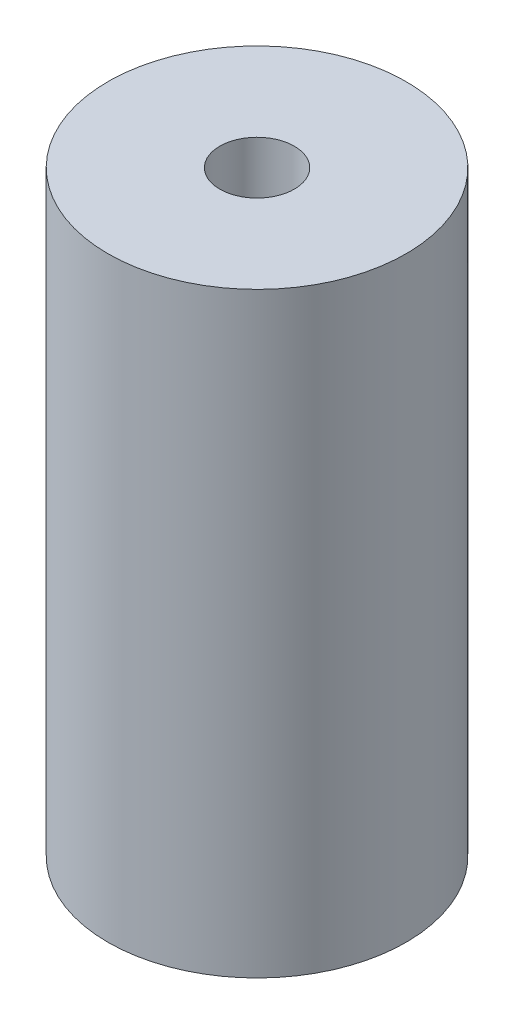
ISO-10303-21;
HEADER;
FILE_DESCRIPTION(('STEP AP214'),'2;1');
FILE_NAME('part.step','',(''),(''),'','','');
FILE_SCHEMA(('AUTOMOTIVE_DESIGN { 1 0 10303 214 1 1 1 1 }'));
ENDSEC;
DATA;
#1=APPLICATION_CONTEXT('core data for automotive mechanical design processes');
#2=APPLICATION_PROTOCOL_DEFINITION('international standard','automotive_design',2000,#1);
#3=PRODUCT_CONTEXT('',#1,'mechanical');
#4=PRODUCT('Part','Part','',(#3));
#5=PRODUCT_RELATED_PRODUCT_CATEGORY('part','',(#4));
#6=PRODUCT_DEFINITION_FORMATION('','',#4);
#7=PRODUCT_DEFINITION_CONTEXT('part definition',#1,'design');
#8=PRODUCT_DEFINITION('design','',#6,#7);
#9=PRODUCT_DEFINITION_SHAPE('','',#8);
#10=(LENGTH_UNIT() NAMED_UNIT(*) SI_UNIT(.MILLI.,.METRE.));
#11=(NAMED_UNIT(*) PLANE_ANGLE_UNIT() SI_UNIT($,.RADIAN.));
#12=(NAMED_UNIT(*) SI_UNIT($,.STERADIAN.) SOLID_ANGLE_UNIT());
#13=UNCERTAINTY_MEASURE_WITH_UNIT(LENGTH_MEASURE(1.E-05),#10,'distance_accuracy_value','');
#14=(GEOMETRIC_REPRESENTATION_CONTEXT(3) GLOBAL_UNCERTAINTY_ASSIGNED_CONTEXT((#13)) GLOBAL_UNIT_ASSIGNED_CONTEXT((#10,
#11,#12)) REPRESENTATION_CONTEXT('',''));
#15=CARTESIAN_POINT('',(0.,0.,0.));
#16=DIRECTION('',(0.,0.,1.));
#17=DIRECTION('',(1.,0.,0.));
#18=AXIS2_PLACEMENT_3D('',#15,#16,#17);
#19=CARTESIAN_POINT('',(0.,40.,0.));
#20=DIRECTION('',(0.,-1.,0.));
#21=DIRECTION('',(0.,0.,-1.));
#22=AXIS2_PLACEMENT_3D('',#19,#20,#21);
#23=CYLINDRICAL_SURFACE('',#22,10.);
#24=CARTESIAN_POINT('',(0.,22.5,-10.));
#25=CARTESIAN_POINT('',(-0.138126814449552,22.4999961237697,-9.99999766446687));
#26=CARTESIAN_POINT('',(-0.276296929717938,22.4885140820437,-9.99710963553044));
#27=CARTESIAN_POINT('',(-0.548677206284221,22.442958081155,-9.98586856383157));
#28=CARTESIAN_POINT('',(-0.682885078117899,22.4088713174369,-9.97751242366627));
#29=CARTESIAN_POINT('',(-0.943368120304294,22.3192679108965,-9.9562604388672));
#30=CARTESIAN_POINT('',(-1.06965260571667,22.2637770021412,-9.94337004736764));
#31=CARTESIAN_POINT('',(-1.31112021984071,22.1330310165919,-9.91442239679369));
#32=CARTESIAN_POINT('',(-1.42630297391461,22.0577752731351,-9.89836503090261));
#33=CARTESIAN_POINT('',(-1.64466987883486,21.8879986839097,-9.86445689319489));
#34=CARTESIAN_POINT('',(-1.74759281676843,21.7931473750682,-9.84657845246877));
#35=CARTESIAN_POINT('',(-1.93624821200553,21.5875796584849,-9.8112270019656));
#36=CARTESIAN_POINT('',(-2.02197872824865,21.4768614617551,-9.79375403816446));
#37=CARTESIAN_POINT('',(-2.17504423799829,21.240674622105,-9.76091292830281));
#38=CARTESIAN_POINT('',(-2.2420870265419,21.1150112819855,-9.74557990774685));
#39=CARTESIAN_POINT('',(-2.35399484758457,20.8537526472333,-9.71915824696694));
#40=CARTESIAN_POINT('',(-2.39886342573357,20.7181589444466,-9.70806892824031));
#41=CARTESIAN_POINT('',(-2.46425806134127,20.4437608363306,-9.69167461160538));
#42=CARTESIAN_POINT('',(-2.48525378055342,20.30507517327,-9.68625818328352));
#43=CARTESIAN_POINT('',(-2.50376962511068,20.0260523850011,-9.68148937432652));
#44=CARTESIAN_POINT('',(-2.50129356969685,19.8857155321798,-9.68213600713214));
#45=CARTESIAN_POINT('',(-2.47331087439951,19.6109736537577,-9.68932009194695));
#46=CARTESIAN_POINT('',(-2.44836390031772,19.4765072975578,-9.69571438345489));
#47=CARTESIAN_POINT('',(-2.37704031150499,19.2137315818149,-9.71344516118448));
#48=CARTESIAN_POINT('',(-2.33066217011566,19.0854226616185,-9.72478199948731));
#49=CARTESIAN_POINT('',(-2.21731579656198,18.8371033062465,-9.75125189842765));
#50=CARTESIAN_POINT('',(-2.1501444453882,18.7171897136841,-9.76642212449693));
#51=CARTESIAN_POINT('',(-1.99726046002491,18.4901354837386,-9.79882851409985));
#52=CARTESIAN_POINT('',(-1.91154458134806,18.3829970865546,-9.81606503891047));
#53=CARTESIAN_POINT('',(-1.72110570780203,18.181327307176,-9.85126467566486));
#54=CARTESIAN_POINT('',(-1.61591043027643,18.0872425165644,-9.86923449130002));
#55=CARTESIAN_POINT('',(-1.39101986250616,17.9179645958935,-9.90343275964594));
#56=CARTESIAN_POINT('',(-1.27132412951324,17.8427720428941,-9.91966115915679));
#57=CARTESIAN_POINT('',(-1.02019314780232,17.7132490229594,-9.94862886823651));
#58=CARTESIAN_POINT('',(-0.888718988681039,17.658991099576,-9.96135600212879));
#59=CARTESIAN_POINT('',(-0.618126680238138,17.5734711571507,-9.98179861652361));
#60=CARTESIAN_POINT('',(-0.479009998584141,17.5422047393031,-9.98951505565468));
#61=CARTESIAN_POINT('',(-0.200899950650045,17.5042373907353,-9.99892498785624));
#62=CARTESIAN_POINT('',(-0.0619945333136836,17.4969282898745,-10.0007675584713));
#63=CARTESIAN_POINT('',(0.215054791335847,17.5054150034258,-9.99864674690754));
#64=CARTESIAN_POINT('',(0.353198766074327,17.5212087379986,-9.99468388736421));
#65=CARTESIAN_POINT('',(0.622690447960817,17.5749515139856,-9.98149301878918));
#66=CARTESIAN_POINT('',(0.754108531614583,17.6125687724616,-9.97234390309647));
#67=CARTESIAN_POINT('',(1.00876215408753,17.7085118067141,-9.94981177723595));
#68=CARTESIAN_POINT('',(1.13199686505442,17.7668396738554,-9.93642833949965));
#69=CARTESIAN_POINT('',(1.36920522404972,17.9037268814578,-9.9065551321037));
#70=CARTESIAN_POINT('',(1.48297573639294,17.9826268539943,-9.89001445610999));
#71=CARTESIAN_POINT('',(1.69587768940552,18.1579831813286,-9.85574181979586));
#72=CARTESIAN_POINT('',(1.79500659828875,18.2544425660294,-9.83800965421578));
#73=CARTESIAN_POINT('',(1.97831761345414,18.4650032680728,-9.80281594932498));
#74=CARTESIAN_POINT('',(2.06207311270184,18.5794795049993,-9.78537173637463));
#75=CARTESIAN_POINT('',(2.20918459835604,18.8212210574476,-9.75321463970069));
#76=CARTESIAN_POINT('',(2.27254149026901,18.9484858049507,-9.73850163474941));
#77=CARTESIAN_POINT('',(2.37658570101223,19.2115095373437,-9.71363491194665));
#78=CARTESIAN_POINT('',(2.41740732773931,19.3472127138538,-9.70345425375809));
#79=CARTESIAN_POINT('',(2.47557609990489,19.6238493964255,-9.68877906706586));
#80=CARTESIAN_POINT('',(2.49292837912652,19.7647817517024,-9.68428329504044));
#81=CARTESIAN_POINT('',(2.50339765056083,20.0435350397694,-9.68158168701612));
#82=CARTESIAN_POINT('',(2.49719649630131,20.1813290585441,-9.68319887888034));
#83=CARTESIAN_POINT('',(2.46229546385366,20.4538398144438,-9.69213181672143));
#84=CARTESIAN_POINT('',(2.43359603781098,20.5885566133553,-9.69944744817731));
#85=CARTESIAN_POINT('',(2.35488553240495,20.8503474317764,-9.71885434473222));
#86=CARTESIAN_POINT('',(2.30500234113404,20.9774621754006,-9.73091692061057));
#87=CARTESIAN_POINT('',(2.18544152267504,21.2216089711893,-9.7584625954084));
#88=CARTESIAN_POINT('',(2.11576115005696,21.3386396219781,-9.77394616867808));
#89=CARTESIAN_POINT('',(1.95644624772858,21.5625910483368,-9.80709390439337));
#90=CARTESIAN_POINT('',(1.86633860485376,21.6691684557066,-9.82480441386302));
#91=CARTESIAN_POINT('',(1.66964895198289,21.8659117413257,-9.86013378743769));
#92=CARTESIAN_POINT('',(1.56306303543524,21.9560737168549,-9.87775262878422));
#93=CARTESIAN_POINT('',(1.33411264450432,22.1190188476077,-9.91129426079449));
#94=CARTESIAN_POINT('',(1.21149737052731,22.1914576894526,-9.92718055609783));
#95=CARTESIAN_POINT('',(0.95544343251746,22.3145791049009,-9.95508208291861));
#96=CARTESIAN_POINT('',(0.822012605727901,22.3652772677476,-9.96710008666302));
#97=CARTESIAN_POINT('',(0.574017088739121,22.4359530505494,-9.98413432609236));
#98=CARTESIAN_POINT('',(0.460633618180115,22.4599187384224,-9.99004308421151));
#99=CARTESIAN_POINT('',(0.231510119227139,22.4919432393699,-9.9979767538658));
#100=CARTESIAN_POINT('',(0.115770268737694,22.5000032488422,-10.0000019575149));
#101=CARTESIAN_POINT('',(0.,22.5,-10.));
#102=B_SPLINE_CURVE_WITH_KNOTS('',3,(#24,#25,#26,#27,#28,#29,#30,#31,#32,#33,#34,#35,#36,#37,
#38,#39,#40,#41,#42,#43,#44,#45,#46,#47,#48,#49,#50,#51,#52,#53,#54,#55,#56,#57,#58,#59,#60,#61,
#62,#63,#64,#65,#66,#67,#68,#69,#70,#71,#72,#73,#74,#75,#76,#77,#78,#79,#80,#81,#82,#83,#84,#85,
#86,#87,#88,#89,#90,#91,#92,#93,#94,#95,#96,#97,#98,#99,#100,#101),.UNSPECIFIED.,.T.,.F.,(4,2,2,
2,2,2,2,2,2,2,2,2,2,2,2,2,2,2,2,2,2,2,2,2,2,2,2,2,2,2,2,2,2,2,2,2,2,2,4),(0.,0.413956187453149,
0.828147062939832,1.24184150381017,1.65554990028221,2.07690725728565,2.4983121596677,
2.92597745909678,3.35357435282281,3.77260491835117,4.19156730193363,4.60037495017231,
5.00921172448932,5.42217546461999,5.83521151399139,6.26002501620567,6.6848514926928,
7.11113715020724,7.53734122819939,7.95263848254328,8.36789835193439,8.7770045752893,
9.18615212209352,9.60255979281121,10.0190393835223,10.4457418201299,10.8724253125471,
11.2965375769764,11.7205570543048,12.1323963400749,12.5442273493652,12.9536066760888,
13.3630428023797,13.7831596069298,14.2033761629383,14.6312030917578,15.0587227304538,
15.4057040491338,15.752659267482),.UNSPECIFIED.);
#103=CARTESIAN_POINT('',(0.,22.5,-10.));
#104=VERTEX_POINT('',#103);
#105=EDGE_CURVE('E65',#104,#104,#102,.T.);
#106=ORIENTED_EDGE('',*,*,#105,.T.);
#107=EDGE_LOOP('',(#106));
#108=FACE_BOUND('',#107,.T.);
#109=CARTESIAN_POINT('',(0.,40.,0.));
#110=DIRECTION('',(0.,1.,0.));
#111=DIRECTION('',(0.,0.,1.));
#112=AXIS2_PLACEMENT_3D('',#109,#110,#111);
#113=CIRCLE('',#112,10.);
#114=CARTESIAN_POINT('',(0.,40.,10.));
#115=VERTEX_POINT('',#114);
#116=EDGE_CURVE('E43',#115,#115,#113,.T.);
#117=ORIENTED_EDGE('',*,*,#116,.F.);
#118=EDGE_LOOP('',(#117));
#119=FACE_BOUND('',#118,.T.);
#120=CARTESIAN_POINT('',(0.,0.,0.));
#121=DIRECTION('',(0.,1.,0.));
#122=DIRECTION('',(0.,0.,1.));
#123=AXIS2_PLACEMENT_3D('',#120,#121,#122);
#124=CIRCLE('',#123,10.);
#125=CARTESIAN_POINT('',(0.,0.,10.));
#126=VERTEX_POINT('',#125);
#127=EDGE_CURVE('E68',#126,#126,#124,.T.);
#128=ORIENTED_EDGE('',*,*,#127,.T.);
#129=EDGE_LOOP('',(#128));
#130=FACE_BOUND('',#129,.T.);
#131=ADVANCED_FACE('F35',(#108,#119,#130),#23,.T.);
#132=CARTESIAN_POINT('',(0.,40.,0.));
#133=DIRECTION('',(0.,1.,0.));
#134=DIRECTION('',(0.,0.,1.));
#135=AXIS2_PLACEMENT_3D('',#132,#133,#134);
#136=PLANE('',#135);
#137=CARTESIAN_POINT('',(0.,40.,0.));
#138=DIRECTION('',(0.,1.,0.));
#139=DIRECTION('',(0.,0.,1.));
#140=AXIS2_PLACEMENT_3D('',#137,#138,#139);
#141=CIRCLE('',#140,2.5);
#142=CARTESIAN_POINT('',(0.,40.,2.5));
#143=VERTEX_POINT('',#142);
#144=EDGE_CURVE('E69',#143,#143,#141,.T.);
#145=ORIENTED_EDGE('',*,*,#144,.F.);
#146=EDGE_LOOP('',(#145));
#147=FACE_BOUND('',#146,.T.);
#148=ORIENTED_EDGE('',*,*,#116,.T.);
#149=EDGE_LOOP('',(#148));
#150=FACE_BOUND('',#149,.T.);
#151=ADVANCED_FACE('F83',(#147,#150),#136,.T.);
#152=CARTESIAN_POINT('',(0.,0.,0.));
#153=DIRECTION('',(0.,1.,0.));
#154=DIRECTION('',(0.,0.,1.));
#155=AXIS2_PLACEMENT_3D('',#152,#153,#154);
#156=PLANE('',#155);
#157=ORIENTED_EDGE('',*,*,#127,.F.);
#158=EDGE_LOOP('',(#157));
#159=FACE_BOUND('',#158,.T.);
#160=ADVANCED_FACE('F90',(#159),#156,.F.);
#161=CARTESIAN_POINT('',(0.,20.,0.));
#162=DIRECTION('',(0.,1.,0.));
#163=DIRECTION('',(0.,0.,1.));
#164=AXIS2_PLACEMENT_3D('',#161,#162,#163);
#165=CYLINDRICAL_SURFACE('',#164,2.5);
#166=CARTESIAN_POINT('',(0.,20.,0.));
#167=DIRECTION('',(0.,1.,0.));
#168=DIRECTION('',(0.,0.,1.));
#169=AXIS2_PLACEMENT_3D('',#166,#167,#168);
#170=CIRCLE('',#169,2.5);
#171=CARTESIAN_POINT('',(-2.5,20.,0.));
#172=VERTEX_POINT('',#171);
#173=CARTESIAN_POINT('',(2.5,20.,0.));
#174=VERTEX_POINT('',#173);
#175=EDGE_CURVE('E64',#172,#174,#170,.T.);
#176=ORIENTED_EDGE('',*,*,#175,.F.);
#177=CARTESIAN_POINT('',(0.,20.,0.));
#178=DIRECTION('',(0.,0.707106781186547,0.707106781186547));
#179=DIRECTION('',(0.,0.707106781186547,-0.707106781186547));
#180=AXIS2_PLACEMENT_3D('',#177,#178,#179);
#181=ELLIPSE('',#180,3.53553390593274,2.5);
#182=EDGE_CURVE('E59',#172,#174,#181,.F.);
#183=ORIENTED_EDGE('',*,*,#182,.T.);
#184=EDGE_LOOP('',(#176,#183));
#185=FACE_BOUND('',#184,.T.);
#186=ORIENTED_EDGE('',*,*,#144,.T.);
#187=EDGE_LOOP('',(#186));
#188=FACE_BOUND('',#187,.T.);
#189=ADVANCED_FACE('F62',(#185,#188),#165,.F.);
#190=CARTESIAN_POINT('',(0.,20.,0.));
#191=DIRECTION('',(0.,1.,0.));
#192=DIRECTION('',(0.,0.,1.));
#193=AXIS2_PLACEMENT_3D('',#190,#191,#192);
#194=PLANE('',#193);
#195=DIRECTION('',(1.,0.,0.));
#196=VECTOR('',#195,1.);
#197=CARTESIAN_POINT('',(0.,20.,0.));
#198=LINE('',#197,#196);
#199=EDGE_CURVE('E11',#172,#174,#198,.T.);
#200=ORIENTED_EDGE('',*,*,#199,.F.);
#201=ORIENTED_EDGE('',*,*,#175,.T.);
#202=EDGE_LOOP('',(#200,#201));
#203=FACE_BOUND('',#202,.T.);
#204=ADVANCED_FACE('F67',(#203),#194,.T.);
#205=CARTESIAN_POINT('',(0.,20.,-20.));
#206=DIRECTION('',(0.,0.,1.));
#207=DIRECTION('',(1.,0.,0.));
#208=AXIS2_PLACEMENT_3D('',#205,#206,#207);
#209=CYLINDRICAL_SURFACE('',#208,2.5);
#210=CARTESIAN_POINT('',(0.,20.,0.));
#211=DIRECTION('',(0.,0.,1.));
#212=DIRECTION('',(1.,0.,0.));
#213=AXIS2_PLACEMENT_3D('',#210,#211,#212);
#214=CIRCLE('',#213,2.5);
#215=EDGE_CURVE('E48',#172,#174,#214,.T.);
#216=ORIENTED_EDGE('',*,*,#215,.T.);
#217=ORIENTED_EDGE('',*,*,#182,.F.);
#218=EDGE_LOOP('',(#216,#217));
#219=FACE_BOUND('',#218,.T.);
#220=ORIENTED_EDGE('',*,*,#105,.F.);
#221=EDGE_LOOP('',(#220));
#222=FACE_BOUND('',#221,.T.);
#223=ADVANCED_FACE('F57',(#219,#222),#209,.F.);
#224=CARTESIAN_POINT('',(0.,20.,0.));
#225=DIRECTION('',(0.,0.,1.));
#226=DIRECTION('',(1.,0.,0.));
#227=AXIS2_PLACEMENT_3D('',#224,#225,#226);
#228=PLANE('',#227);
#229=ORIENTED_EDGE('',*,*,#199,.T.);
#230=ORIENTED_EDGE('',*,*,#215,.F.);
#231=EDGE_LOOP('',(#229,#230));
#232=FACE_BOUND('',#231,.T.);
#233=ADVANCED_FACE('F51',(#232),#228,.F.);
#234=CLOSED_SHELL('',(#131,#151,#160,#189,#204,#223,#233));
#235=MANIFOLD_SOLID_BREP('B2',#234);
#236=ADVANCED_BREP_SHAPE_REPRESENTATION('',(#18,#235),#14);
#237=SHAPE_DEFINITION_REPRESENTATION(#9,#236);
ENDSEC;
END-ISO-10303-21;
